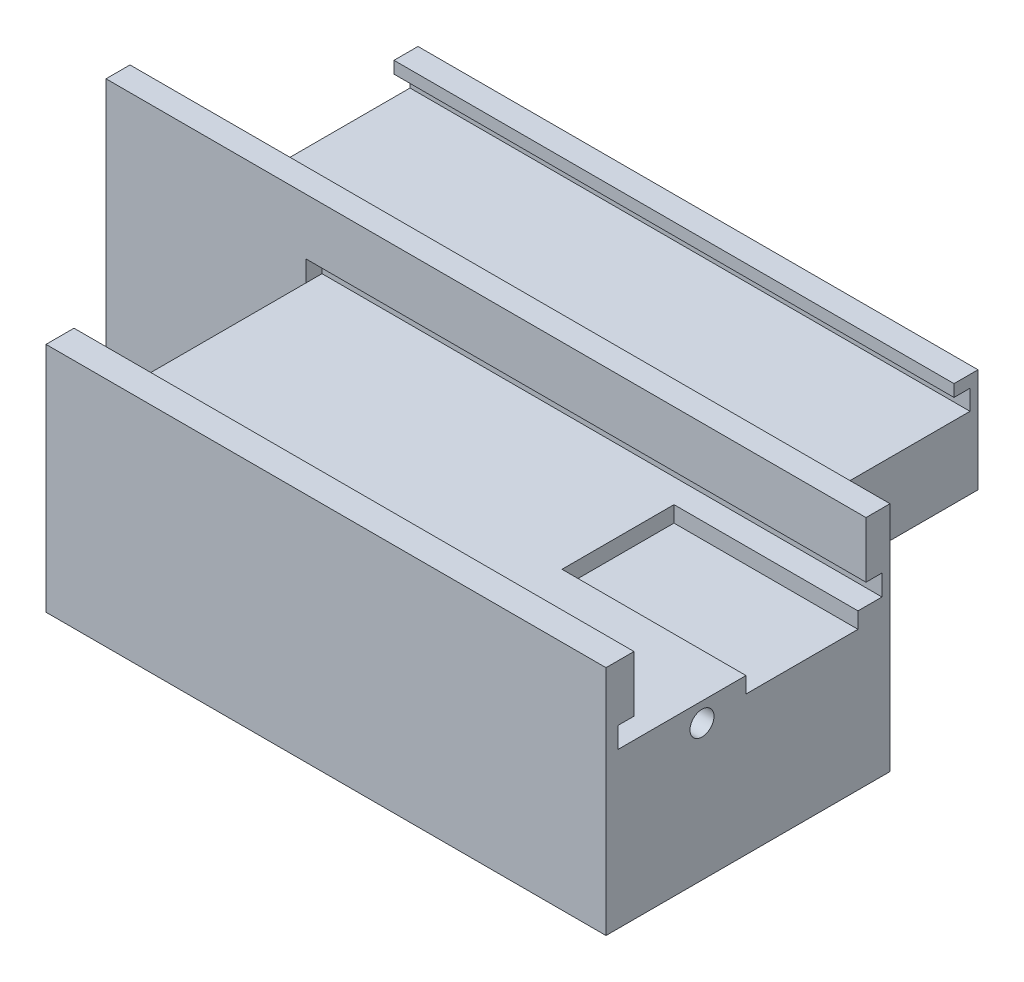
ISO-10303-21;
HEADER;
FILE_DESCRIPTION(('STEP AP214'),'2;1');
FILE_NAME('part.step','',(''),(''),'','','');
FILE_SCHEMA(('AUTOMOTIVE_DESIGN { 1 0 10303 214 1 1 1 1 }'));
ENDSEC;
DATA;
#1=APPLICATION_CONTEXT('core data for automotive mechanical design processes');
#2=APPLICATION_PROTOCOL_DEFINITION('international standard','automotive_design',2000,#1);
#3=PRODUCT_CONTEXT('',#1,'mechanical');
#4=PRODUCT('Part','Part','',(#3));
#5=PRODUCT_RELATED_PRODUCT_CATEGORY('part','',(#4));
#6=PRODUCT_DEFINITION_FORMATION('','',#4);
#7=PRODUCT_DEFINITION_CONTEXT('part definition',#1,'design');
#8=PRODUCT_DEFINITION('design','',#6,#7);
#9=PRODUCT_DEFINITION_SHAPE('','',#8);
#10=(LENGTH_UNIT() NAMED_UNIT(*) SI_UNIT(.MILLI.,.METRE.));
#11=(NAMED_UNIT(*) PLANE_ANGLE_UNIT() SI_UNIT($,.RADIAN.));
#12=(NAMED_UNIT(*) SI_UNIT($,.STERADIAN.) SOLID_ANGLE_UNIT());
#13=UNCERTAINTY_MEASURE_WITH_UNIT(LENGTH_MEASURE(1.E-05),#10,'distance_accuracy_value','');
#14=(GEOMETRIC_REPRESENTATION_CONTEXT(3) GLOBAL_UNCERTAINTY_ASSIGNED_CONTEXT((#13)) GLOBAL_UNIT_ASSIGNED_CONTEXT((#10,
#11,#12)) REPRESENTATION_CONTEXT('',''));
#15=CARTESIAN_POINT('',(0.,0.,0.));
#16=DIRECTION('',(0.,0.,1.));
#17=DIRECTION('',(1.,0.,0.));
#18=AXIS2_PLACEMENT_3D('',#15,#16,#17);
#19=CARTESIAN_POINT('',(65.2402968863677,6.11716392909726,18.1443884767127));
#20=DIRECTION('',(1.,0.,0.));
#21=DIRECTION('',(0.,-1.,0.));
#22=AXIS2_PLACEMENT_3D('',#19,#20,#21);
#23=PLANE('',#22);
#24=CARTESIAN_POINT('',(65.2402968863677,3.21716392909729,40.1443244767127));
#25=DIRECTION('',(1.,0.,0.));
#26=DIRECTION('',(0.,0.,-1.));
#27=AXIS2_PLACEMENT_3D('',#24,#25,#26);
#28=CIRCLE('',#27,1.5);
#29=CARTESIAN_POINT('',(65.2402968863677,3.21716392909729,38.6443244767127));
#30=VERTEX_POINT('',#29);
#31=EDGE_CURVE('E607',#30,#30,#28,.T.);
#32=ORIENTED_EDGE('',*,*,#31,.F.);
#33=EDGE_LOOP('',(#32));
#34=FACE_BOUND('',#33,.T.);
#35=DIRECTION('',(0.,0.,1.));
#36=VECTOR('',#35,1.);
#37=CARTESIAN_POINT('',(65.2402968863677,-13.7828360709027,52.1443244767127));
#38=LINE('',#37,#36);
#39=CARTESIAN_POINT('',(65.2402968863677,-13.7828360709027,16.6443884767128));
#40=VERTEX_POINT('',#39);
#41=CARTESIAN_POINT('',(65.2402968863677,-13.7828360709027,52.1443244767127));
#42=VERTEX_POINT('',#41);
#43=EDGE_CURVE('E313',#40,#42,#38,.T.);
#44=ORIENTED_EDGE('',*,*,#43,.F.);
#45=DIRECTION('',(0.,-1.,0.));
#46=VECTOR('',#45,1.);
#47=CARTESIAN_POINT('',(65.2402968863677,-2.28283607090271,16.6443884767127));
#48=LINE('',#47,#46);
#49=CARTESIAN_POINT('',(65.2402968863677,15.2171639290973,16.6443884767128));
#50=VERTEX_POINT('',#49);
#51=EDGE_CURVE('E251',#50,#40,#48,.T.);
#52=ORIENTED_EDGE('',*,*,#51,.F.);
#53=DIRECTION('',(0.,0.,-1.));
#54=VECTOR('',#53,1.);
#55=CARTESIAN_POINT('',(65.2402968863677,15.2171639290973,16.6443884767128));
#56=LINE('',#55,#54);
#57=CARTESIAN_POINT('',(65.2402968863677,15.2171639290973,19.6443884767127));
#58=VERTEX_POINT('',#57);
#59=EDGE_CURVE('E263',#58,#50,#56,.T.);
#60=ORIENTED_EDGE('',*,*,#59,.F.);
#61=DIRECTION('',(0.,1.,0.));
#62=VECTOR('',#61,1.);
#63=CARTESIAN_POINT('',(65.2402968863677,15.2171639290973,19.6443884767127));
#64=LINE('',#63,#62);
#65=CARTESIAN_POINT('',(65.2402968863677,8.21716392909729,19.6443884767127));
#66=VERTEX_POINT('',#65);
#67=EDGE_CURVE('E267',#66,#58,#64,.T.);
#68=ORIENTED_EDGE('',*,*,#67,.F.);
#69=DIRECTION('',(0.,0.,1.));
#70=VECTOR('',#69,1.);
#71=CARTESIAN_POINT('',(65.2402968863677,8.21716392909729,19.6443884767127));
#72=LINE('',#71,#70);
#73=CARTESIAN_POINT('',(65.2402968863677,8.21716392909729,17.6443884767127));
#74=VERTEX_POINT('',#73);
#75=EDGE_CURVE('E272',#74,#66,#72,.T.);
#76=ORIENTED_EDGE('',*,*,#75,.F.);
#77=DIRECTION('',(0.,1.,0.));
#78=VECTOR('',#77,1.);
#79=CARTESIAN_POINT('',(65.2402968863677,8.21716392909729,17.6443884767127));
#80=LINE('',#79,#78);
#81=CARTESIAN_POINT('',(65.2402968863677,5.6171639290973,17.6443884767127));
#82=VERTEX_POINT('',#81);
#83=EDGE_CURVE('E277',#82,#74,#80,.T.);
#84=ORIENTED_EDGE('',*,*,#83,.F.);
#85=DIRECTION('',(0.,0.,-1.));
#86=VECTOR('',#85,1.);
#87=CARTESIAN_POINT('',(65.2402968863677,5.6171639290973,50.6443244767127));
#88=LINE('',#87,#86);
#89=CARTESIAN_POINT('',(65.2402968863677,5.6171639290973,20.6443884767127));
#90=VERTEX_POINT('',#89);
#91=EDGE_CURVE('E287',#90,#82,#88,.T.);
#92=ORIENTED_EDGE('',*,*,#91,.F.);
#93=DIRECTION('',(0.,1.,0.));
#94=VECTOR('',#93,1.);
#95=CARTESIAN_POINT('',(65.2402968863677,3.6171639290973,20.6443884767127));
#96=LINE('',#95,#94);
#97=CARTESIAN_POINT('',(65.2402968863677,3.6171639290973,20.6443884767127));
#98=VERTEX_POINT('',#97);
#99=EDGE_CURVE('E513',#98,#90,#96,.T.);
#100=ORIENTED_EDGE('',*,*,#99,.F.);
#101=DIRECTION('',(0.,0.,-1.));
#102=VECTOR('',#101,1.);
#103=CARTESIAN_POINT('',(65.2402968863677,3.6171639290973,20.6443884767127));
#104=LINE('',#103,#102);
#105=CARTESIAN_POINT('',(65.2402968863677,3.6171639290973,34.6443884767127));
#106=VERTEX_POINT('',#105);
#107=EDGE_CURVE('E496',#106,#98,#104,.T.);
#108=ORIENTED_EDGE('',*,*,#107,.F.);
#109=DIRECTION('',(0.,1.,0.));
#110=VECTOR('',#109,1.);
#111=CARTESIAN_POINT('',(65.2402968863677,3.6171639290973,34.6443884767127));
#112=LINE('',#111,#110);
#113=CARTESIAN_POINT('',(65.2402968863677,5.6171639290973,34.6443884767127));
#114=VERTEX_POINT('',#113);
#115=EDGE_CURVE('E393',#106,#114,#112,.T.);
#116=ORIENTED_EDGE('',*,*,#115,.T.);
#117=CARTESIAN_POINT('',(65.2402968863677,5.6171639290973,50.6443244767127));
#118=VERTEX_POINT('',#117);
#119=EDGE_CURVE('E282',#118,#114,#88,.T.);
#120=ORIENTED_EDGE('',*,*,#119,.F.);
#121=DIRECTION('',(0.,-1.,0.));
#122=VECTOR('',#121,1.);
#123=CARTESIAN_POINT('',(65.2402968863677,5.6171639290973,50.6443244767127));
#124=LINE('',#123,#122);
#125=CARTESIAN_POINT('',(65.2402968863677,8.21716392909729,50.6443244767127));
#126=VERTEX_POINT('',#125);
#127=EDGE_CURVE('E288',#126,#118,#124,.T.);
#128=ORIENTED_EDGE('',*,*,#127,.F.);
#129=DIRECTION('',(0.,0.,1.));
#130=VECTOR('',#129,1.);
#131=CARTESIAN_POINT('',(65.2402968863677,8.21716392909729,50.6443244767127));
#132=LINE('',#131,#130);
#133=CARTESIAN_POINT('',(65.2402968863677,8.21716392909729,48.6443244767127));
#134=VERTEX_POINT('',#133);
#135=EDGE_CURVE('E293',#134,#126,#132,.T.);
#136=ORIENTED_EDGE('',*,*,#135,.F.);
#137=DIRECTION('',(0.,-1.,0.));
#138=VECTOR('',#137,1.);
#139=CARTESIAN_POINT('',(65.2402968863677,8.21716392909729,48.6443244767127));
#140=LINE('',#139,#138);
#141=CARTESIAN_POINT('',(65.2402968863677,15.2171639290973,48.6443244767127));
#142=VERTEX_POINT('',#141);
#143=EDGE_CURVE('E298',#142,#134,#140,.T.);
#144=ORIENTED_EDGE('',*,*,#143,.F.);
#145=DIRECTION('',(0.,0.,-1.));
#146=VECTOR('',#145,1.);
#147=CARTESIAN_POINT('',(65.2402968863677,15.2171639290973,48.6443244767127));
#148=LINE('',#147,#146);
#149=CARTESIAN_POINT('',(65.2402968863677,15.2171639290973,52.1443244767127));
#150=VERTEX_POINT('',#149);
#151=EDGE_CURVE('E303',#150,#142,#148,.T.);
#152=ORIENTED_EDGE('',*,*,#151,.F.);
#153=DIRECTION('',(0.,1.,0.));
#154=VECTOR('',#153,1.);
#155=CARTESIAN_POINT('',(65.2402968863677,15.2171639290973,52.1443244767127));
#156=LINE('',#155,#154);
#157=EDGE_CURVE('E308',#42,#150,#156,.T.);
#158=ORIENTED_EDGE('',*,*,#157,.F.);
#159=EDGE_LOOP('',(#44,#52,#60,#68,#76,#84,#92,#100,#108,#116,#120,#128,#136,#144,#152,#158));
#160=FACE_BOUND('',#159,.T.);
#161=ADVANCED_FACE('F43',(#34,#160),#23,.T.);
#162=CARTESIAN_POINT('',(-29.7595631136323,0.,0.));
#163=DIRECTION('',(1.,0.,0.));
#164=DIRECTION('',(0.,0.,-1.));
#165=AXIS2_PLACEMENT_3D('',#162,#163,#164);
#166=PLANE('',#165);
#167=CARTESIAN_POINT('',(-29.7595631136323,-7.18283607090269,-1.35561152328723));
#168=DIRECTION('',(-1.,0.,0.));
#169=DIRECTION('',(0.,0.,1.));
#170=AXIS2_PLACEMENT_3D('',#167,#168,#169);
#171=CIRCLE('',#170,1.5);
#172=CARTESIAN_POINT('',(-29.7595631136323,-7.18283607090269,0.144388476712772));
#173=VERTEX_POINT('',#172);
#174=EDGE_CURVE('E617',#173,#173,#171,.T.);
#175=ORIENTED_EDGE('',*,*,#174,.F.);
#176=EDGE_LOOP('',(#175));
#177=FACE_BOUND('',#176,.T.);
#178=DIRECTION('',(0.,0.,1.));
#179=VECTOR('',#178,1.);
#180=CARTESIAN_POINT('',(-29.7595631136323,-13.7828360709027,52.1443244767127));
#181=LINE('',#180,#179);
#182=CARTESIAN_POINT('',(-29.7595631136323,-13.7828360709027,-19.3556115232873));
#183=VERTEX_POINT('',#182);
#184=CARTESIAN_POINT('',(-29.7595631136323,-13.7828360709027,19.6443884767127));
#185=VERTEX_POINT('',#184);
#186=EDGE_CURVE('E379',#183,#185,#181,.T.);
#187=ORIENTED_EDGE('',*,*,#186,.T.);
#188=DIRECTION('',(0.,1.,0.));
#189=VECTOR('',#188,1.);
#190=CARTESIAN_POINT('',(-29.7595631136323,15.2171639290973,19.6443884767127));
#191=LINE('',#190,#189);
#192=CARTESIAN_POINT('',(-29.7595631136323,15.2171639290973,19.6443884767127));
#193=VERTEX_POINT('',#192);
#194=EDGE_CURVE('E375',#185,#193,#191,.T.);
#195=ORIENTED_EDGE('',*,*,#194,.T.);
#196=DIRECTION('',(0.,0.,-1.));
#197=VECTOR('',#196,1.);
#198=CARTESIAN_POINT('',(-29.7595631136323,15.2171639290973,16.6443884767128));
#199=LINE('',#198,#197);
#200=CARTESIAN_POINT('',(-29.7595631136323,15.2171639290973,16.6443884767128));
#201=VERTEX_POINT('',#200);
#202=EDGE_CURVE('E371',#193,#201,#199,.T.);
#203=ORIENTED_EDGE('',*,*,#202,.T.);
#204=DIRECTION('',(0.,-1.,0.));
#205=VECTOR('',#204,1.);
#206=CARTESIAN_POINT('',(-29.7595631136323,-2.28283607090271,16.6443884767127));
#207=LINE('',#206,#205);
#208=CARTESIAN_POINT('',(-29.7595631136323,-2.28283607090271,16.6443884767127));
#209=VERTEX_POINT('',#208);
#210=EDGE_CURVE('E365',#201,#209,#207,.T.);
#211=ORIENTED_EDGE('',*,*,#210,.T.);
#212=DIRECTION('',(0.,0.,1.));
#213=VECTOR('',#212,1.);
#214=CARTESIAN_POINT('',(-29.7595631136323,-2.28283607090271,18.6443884767127));
#215=LINE('',#214,#213);
#216=CARTESIAN_POINT('',(-29.7595631136323,-2.28283607090271,18.6443884767127));
#217=VERTEX_POINT('',#216);
#218=EDGE_CURVE('E247',#209,#217,#215,.T.);
#219=ORIENTED_EDGE('',*,*,#218,.T.);
#220=DIRECTION('',(0.,-1.,0.));
#221=VECTOR('',#220,1.);
#222=CARTESIAN_POINT('',(-29.7595631136323,-4.78283607090269,18.6443884767127));
#223=LINE('',#222,#221);
#224=CARTESIAN_POINT('',(-29.7595631136323,-4.78283607090269,18.6443884767127));
#225=VERTEX_POINT('',#224);
#226=EDGE_CURVE('E347',#217,#225,#223,.T.);
#227=ORIENTED_EDGE('',*,*,#226,.T.);
#228=DIRECTION('',(0.,0.,-1.));
#229=VECTOR('',#228,1.);
#230=CARTESIAN_POINT('',(-29.7595631136323,-4.78283607090269,-18.3556115232873));
#231=LINE('',#230,#229);
#232=CARTESIAN_POINT('',(-29.7595631136323,-4.78283607090269,-18.3556115232873));
#233=VERTEX_POINT('',#232);
#234=EDGE_CURVE('E350',#225,#233,#231,.T.);
#235=ORIENTED_EDGE('',*,*,#234,.T.);
#236=DIRECTION('',(0.,1.,0.));
#237=VECTOR('',#236,1.);
#238=CARTESIAN_POINT('',(-29.7595631136323,-2.28283607090271,-18.3556115232873));
#239=LINE('',#238,#237);
#240=CARTESIAN_POINT('',(-29.7595631136323,-2.28283607090271,-18.3556115232873));
#241=VERTEX_POINT('',#240);
#242=EDGE_CURVE('E358',#233,#241,#239,.T.);
#243=ORIENTED_EDGE('',*,*,#242,.T.);
#244=DIRECTION('',(0.,0.,1.));
#245=VECTOR('',#244,1.);
#246=CARTESIAN_POINT('',(-29.7595631136323,-2.28283607090271,-16.3556115232873));
#247=LINE('',#246,#245);
#248=CARTESIAN_POINT('',(-29.7595631136323,-2.28283607090271,-16.3556115232873));
#249=VERTEX_POINT('',#248);
#250=EDGE_CURVE('E319',#241,#249,#247,.T.);
#251=ORIENTED_EDGE('',*,*,#250,.T.);
#252=DIRECTION('',(0.,1.,0.));
#253=VECTOR('',#252,1.);
#254=CARTESIAN_POINT('',(-29.7595631136323,-0.782836070902714,-16.3556115232873));
#255=LINE('',#254,#253);
#256=CARTESIAN_POINT('',(-29.7595631136323,-0.782836070902714,-16.3556115232873));
#257=VERTEX_POINT('',#256);
#258=EDGE_CURVE('E390',#249,#257,#255,.T.);
#259=ORIENTED_EDGE('',*,*,#258,.T.);
#260=DIRECTION('',(0.,0.,-1.));
#261=VECTOR('',#260,1.);
#262=CARTESIAN_POINT('',(-29.7595631136323,-0.782836070902714,-19.3556115232873));
#263=LINE('',#262,#261);
#264=CARTESIAN_POINT('',(-29.7595631136323,-0.782836070902714,-19.3556115232873));
#265=VERTEX_POINT('',#264);
#266=EDGE_CURVE('E386',#257,#265,#263,.T.);
#267=ORIENTED_EDGE('',*,*,#266,.T.);
#268=DIRECTION('',(0.,-1.,0.));
#269=VECTOR('',#268,1.);
#270=CARTESIAN_POINT('',(-29.7595631136323,-13.7828360709027,-19.3556115232873));
#271=LINE('',#270,#269);
#272=EDGE_CURVE('E382',#265,#183,#271,.T.);
#273=ORIENTED_EDGE('',*,*,#272,.T.);
#274=EDGE_LOOP('',(#187,#195,#203,#211,#219,#227,#235,#243,#251,#259,#267,#273));
#275=FACE_BOUND('',#274,.T.);
#276=ADVANCED_FACE('F361',(#177,#275),#166,.F.);
#277=CARTESIAN_POINT('',(142.397544426726,-0.782836070902714,-19.3556115232873));
#278=DIRECTION('',(0.,1.,0.));
#279=DIRECTION('',(0.,0.,1.));
#280=AXIS2_PLACEMENT_3D('',#277,#278,#279);
#281=PLANE('',#280);
#282=DIRECTION('',(0.,0.,1.));
#283=VECTOR('',#282,1.);
#284=CARTESIAN_POINT('',(40.2404368863677,-0.782836070902714,-19.3556115232873));
#285=LINE('',#284,#283);
#286=CARTESIAN_POINT('',(40.2404368863677,-0.782836070902718,-19.3556115232873));
#287=VERTEX_POINT('',#286);
#288=CARTESIAN_POINT('',(40.2404368863677,-0.782836070902714,-16.3556115232873));
#289=VERTEX_POINT('',#288);
#290=EDGE_CURVE('E65',#287,#289,#285,.T.);
#291=ORIENTED_EDGE('',*,*,#290,.F.);
#292=DIRECTION('',(-1.,0.,0.));
#293=VECTOR('',#292,1.);
#294=CARTESIAN_POINT('',(142.397544426726,-0.782836070902714,-19.3556115232873));
#295=LINE('',#294,#293);
#296=EDGE_CURVE('E317',#287,#265,#295,.T.);
#297=ORIENTED_EDGE('',*,*,#296,.T.);
#298=ORIENTED_EDGE('',*,*,#266,.F.);
#299=DIRECTION('',(-1.,0.,0.));
#300=VECTOR('',#299,1.);
#301=CARTESIAN_POINT('',(142.397544426726,-0.782836070902714,-16.3556115232873));
#302=LINE('',#301,#300);
#303=EDGE_CURVE('E51',#289,#257,#302,.T.);
#304=ORIENTED_EDGE('',*,*,#303,.F.);
#305=EDGE_LOOP('',(#291,#297,#298,#304));
#306=FACE_BOUND('',#305,.T.);
#307=ADVANCED_FACE('F602',(#306),#281,.T.);
#308=CARTESIAN_POINT('',(142.397544426726,-13.7828360709027,-19.3556115232873));
#309=DIRECTION('',(0.,0.,-1.));
#310=DIRECTION('',(0.,1.,0.));
#311=AXIS2_PLACEMENT_3D('',#308,#309,#310);
#312=PLANE('',#311);
#313=DIRECTION('',(0.,1.,0.));
#314=VECTOR('',#313,1.);
#315=CARTESIAN_POINT('',(40.2404368863677,-13.7828360709027,-19.3556115232873));
#316=LINE('',#315,#314);
#317=CARTESIAN_POINT('',(40.2404368863677,-13.7828360709027,-19.3556115232873));
#318=VERTEX_POINT('',#317);
#319=EDGE_CURVE('E464',#318,#287,#316,.T.);
#320=ORIENTED_EDGE('',*,*,#319,.F.);
#321=DIRECTION('',(-1.,0.,0.));
#322=VECTOR('',#321,1.);
#323=CARTESIAN_POINT('',(142.397544426726,-13.7828360709027,-19.3556115232873));
#324=LINE('',#323,#322);
#325=EDGE_CURVE('E314',#318,#183,#324,.T.);
#326=ORIENTED_EDGE('',*,*,#325,.T.);
#327=ORIENTED_EDGE('',*,*,#272,.F.);
#328=ORIENTED_EDGE('',*,*,#296,.F.);
#329=EDGE_LOOP('',(#320,#326,#327,#328));
#330=FACE_BOUND('',#329,.T.);
#331=ADVANCED_FACE('F897',(#330),#312,.T.);
#332=CARTESIAN_POINT('',(142.397544426726,-13.7828360709027,52.1443244767127));
#333=DIRECTION('',(0.,-1.,0.));
#334=DIRECTION('',(0.,0.,-1.));
#335=AXIS2_PLACEMENT_3D('',#332,#333,#334);
#336=PLANE('',#335);
#337=DIRECTION('',(-1.,0.,0.));
#338=VECTOR('',#337,1.);
#339=CARTESIAN_POINT('',(-29.7595631136323,-13.7828360709027,19.6443884767127));
#340=LINE('',#339,#338);
#341=CARTESIAN_POINT('',(-4.75956311363234,-13.7828360709027,19.6443884767127));
#342=VERTEX_POINT('',#341);
#343=EDGE_CURVE('E444',#342,#185,#340,.T.);
#344=ORIENTED_EDGE('',*,*,#343,.T.);
#345=ORIENTED_EDGE('',*,*,#186,.F.);
#346=ORIENTED_EDGE('',*,*,#325,.F.);
#347=DIRECTION('',(0.,0.,1.));
#348=VECTOR('',#347,1.);
#349=CARTESIAN_POINT('',(40.2404368863677,-13.7828360709027,-19.3556115232873));
#350=LINE('',#349,#348);
#351=CARTESIAN_POINT('',(40.2404368863677,-13.7828360709027,16.6443884767128));
#352=VERTEX_POINT('',#351);
#353=EDGE_CURVE('E439',#318,#352,#350,.T.);
#354=ORIENTED_EDGE('',*,*,#353,.T.);
#355=DIRECTION('',(1.,0.,0.));
#356=VECTOR('',#355,1.);
#357=CARTESIAN_POINT('',(65.2402968863677,-13.7828360709027,16.6443884767128));
#358=LINE('',#357,#356);
#359=EDGE_CURVE('E447',#352,#40,#358,.T.);
#360=ORIENTED_EDGE('',*,*,#359,.T.);
#361=ORIENTED_EDGE('',*,*,#43,.T.);
#362=DIRECTION('',(-1.,0.,0.));
#363=VECTOR('',#362,1.);
#364=CARTESIAN_POINT('',(142.397544426726,-13.7828360709027,52.1443244767127));
#365=LINE('',#364,#363);
#366=CARTESIAN_POINT('',(-4.75956311363235,-13.7828360709027,52.1443244767127));
#367=VERTEX_POINT('',#366);
#368=EDGE_CURVE('E309',#42,#367,#365,.T.);
#369=ORIENTED_EDGE('',*,*,#368,.T.);
#370=DIRECTION('',(0.,0.,-1.));
#371=VECTOR('',#370,1.);
#372=CARTESIAN_POINT('',(-4.75956311363235,-13.7828360709027,52.1443244767127));
#373=LINE('',#372,#371);
#374=EDGE_CURVE('E438',#367,#342,#373,.T.);
#375=ORIENTED_EDGE('',*,*,#374,.T.);
#376=EDGE_LOOP('',(#344,#345,#346,#354,#360,#361,#369,#375));
#377=FACE_BOUND('',#376,.T.);
#378=ADVANCED_FACE('F571',(#377),#336,.T.);
#379=CARTESIAN_POINT('',(142.397544426726,15.2171639290973,52.1443244767127));
#380=DIRECTION('',(0.,0.,1.));
#381=DIRECTION('',(0.,-1.,0.));
#382=AXIS2_PLACEMENT_3D('',#379,#380,#381);
#383=PLANE('',#382);
#384=DIRECTION('',(0.,1.,0.));
#385=VECTOR('',#384,1.);
#386=CARTESIAN_POINT('',(-4.75956311363235,-13.7828360709027,52.1443244767127));
#387=LINE('',#386,#385);
#388=CARTESIAN_POINT('',(-4.75956311363235,15.2171639290973,52.1443244767127));
#389=VERTEX_POINT('',#388);
#390=EDGE_CURVE('E456',#367,#389,#387,.T.);
#391=ORIENTED_EDGE('',*,*,#390,.F.);
#392=ORIENTED_EDGE('',*,*,#368,.F.);
#393=ORIENTED_EDGE('',*,*,#157,.T.);
#394=DIRECTION('',(-1.,0.,0.));
#395=VECTOR('',#394,1.);
#396=CARTESIAN_POINT('',(142.397544426726,15.2171639290973,52.1443244767127));
#397=LINE('',#396,#395);
#398=EDGE_CURVE('E304',#150,#389,#397,.T.);
#399=ORIENTED_EDGE('',*,*,#398,.T.);
#400=EDGE_LOOP('',(#391,#392,#393,#399));
#401=FACE_BOUND('',#400,.T.);
#402=ADVANCED_FACE('F427',(#401),#383,.T.);
#403=CARTESIAN_POINT('',(142.397544426726,15.2171639290973,48.6443244767127));
#404=DIRECTION('',(0.,1.,0.));
#405=DIRECTION('',(0.,0.,1.));
#406=AXIS2_PLACEMENT_3D('',#403,#404,#405);
#407=PLANE('',#406);
#408=DIRECTION('',(0.,0.,-1.));
#409=VECTOR('',#408,1.);
#410=CARTESIAN_POINT('',(-4.75956311363235,15.2171639290973,52.1443244767127));
#411=LINE('',#410,#409);
#412=CARTESIAN_POINT('',(-4.75956311363235,15.2171639290973,48.6443244767127));
#413=VERTEX_POINT('',#412);
#414=EDGE_CURVE('E435',#389,#413,#411,.T.);
#415=ORIENTED_EDGE('',*,*,#414,.F.);
#416=ORIENTED_EDGE('',*,*,#398,.F.);
#417=ORIENTED_EDGE('',*,*,#151,.T.);
#418=DIRECTION('',(-1.,0.,0.));
#419=VECTOR('',#418,1.);
#420=CARTESIAN_POINT('',(142.397544426726,15.2171639290973,48.6443244767127));
#421=LINE('',#420,#419);
#422=EDGE_CURVE('E299',#142,#413,#421,.T.);
#423=ORIENTED_EDGE('',*,*,#422,.T.);
#424=EDGE_LOOP('',(#415,#416,#417,#423));
#425=FACE_BOUND('',#424,.T.);
#426=ADVANCED_FACE('F434',(#425),#407,.T.);
#427=CARTESIAN_POINT('',(142.397544426726,8.21716392909729,48.6443244767127));
#428=DIRECTION('',(0.,0.,-1.));
#429=DIRECTION('',(-1.,0.,0.));
#430=AXIS2_PLACEMENT_3D('',#427,#428,#429);
#431=PLANE('',#430);
#432=DIRECTION('',(0.,-1.,0.));
#433=VECTOR('',#432,1.);
#434=CARTESIAN_POINT('',(-4.75956311363235,8.21716392909729,48.6443244767127));
#435=LINE('',#434,#433);
#436=CARTESIAN_POINT('',(-4.75956311363235,8.21716392909729,48.6443244767127));
#437=VERTEX_POINT('',#436);
#438=EDGE_CURVE('E492',#413,#437,#435,.T.);
#439=ORIENTED_EDGE('',*,*,#438,.F.);
#440=ORIENTED_EDGE('',*,*,#422,.F.);
#441=ORIENTED_EDGE('',*,*,#143,.T.);
#442=DIRECTION('',(-1.,0.,0.));
#443=VECTOR('',#442,1.);
#444=CARTESIAN_POINT('',(142.397544426726,8.21716392909729,48.6443244767127));
#445=LINE('',#444,#443);
#446=EDGE_CURVE('E294',#134,#437,#445,.T.);
#447=ORIENTED_EDGE('',*,*,#446,.T.);
#448=EDGE_LOOP('',(#439,#440,#441,#447));
#449=FACE_BOUND('',#448,.T.);
#450=ADVANCED_FACE('F862',(#449),#431,.T.);
#451=CARTESIAN_POINT('',(142.397544426726,8.21716392909729,50.6443244767127));
#452=DIRECTION('',(0.,-1.,0.));
#453=DIRECTION('',(0.,0.,-1.));
#454=AXIS2_PLACEMENT_3D('',#451,#452,#453);
#455=PLANE('',#454);
#456=DIRECTION('',(0.,0.,1.));
#457=VECTOR('',#456,1.);
#458=CARTESIAN_POINT('',(-4.75956311363235,8.21716392909729,50.6443244767127));
#459=LINE('',#458,#457);
#460=CARTESIAN_POINT('',(-4.75956311363235,8.21716392909729,50.6443244767127));
#461=VERTEX_POINT('',#460);
#462=EDGE_CURVE('E489',#437,#461,#459,.T.);
#463=ORIENTED_EDGE('',*,*,#462,.F.);
#464=ORIENTED_EDGE('',*,*,#446,.F.);
#465=ORIENTED_EDGE('',*,*,#135,.T.);
#466=DIRECTION('',(-1.,0.,0.));
#467=VECTOR('',#466,1.);
#468=CARTESIAN_POINT('',(142.397544426726,8.21716392909729,50.6443244767127));
#469=LINE('',#468,#467);
#470=EDGE_CURVE('E289',#126,#461,#469,.T.);
#471=ORIENTED_EDGE('',*,*,#470,.T.);
#472=EDGE_LOOP('',(#463,#464,#465,#471));
#473=FACE_BOUND('',#472,.T.);
#474=ADVANCED_FACE('F852',(#473),#455,.T.);
#475=CARTESIAN_POINT('',(142.397544426726,5.6171639290973,50.6443244767127));
#476=DIRECTION('',(0.,0.,-1.));
#477=DIRECTION('',(-1.,0.,0.));
#478=AXIS2_PLACEMENT_3D('',#475,#476,#477);
#479=PLANE('',#478);
#480=DIRECTION('',(0.,-1.,0.));
#481=VECTOR('',#480,1.);
#482=CARTESIAN_POINT('',(-4.75956311363235,5.6171639290973,50.6443244767127));
#483=LINE('',#482,#481);
#484=CARTESIAN_POINT('',(-4.75956311363235,5.6171639290973,50.6443244767127));
#485=VERTEX_POINT('',#484);
#486=EDGE_CURVE('E58',#461,#485,#483,.T.);
#487=ORIENTED_EDGE('',*,*,#486,.F.);
#488=ORIENTED_EDGE('',*,*,#470,.F.);
#489=ORIENTED_EDGE('',*,*,#127,.T.);
#490=DIRECTION('',(-1.,0.,0.));
#491=VECTOR('',#490,1.);
#492=CARTESIAN_POINT('',(142.397544426726,5.6171639290973,50.6443244767127));
#493=LINE('',#492,#491);
#494=EDGE_CURVE('E283',#118,#485,#493,.T.);
#495=ORIENTED_EDGE('',*,*,#494,.T.);
#496=EDGE_LOOP('',(#487,#488,#489,#495));
#497=FACE_BOUND('',#496,.T.);
#498=ADVANCED_FACE('F843',(#497),#479,.T.);
#499=CARTESIAN_POINT('',(142.397544426726,5.6171639290973,50.6443244767127));
#500=DIRECTION('',(0.,1.,0.));
#501=DIRECTION('',(0.,0.,1.));
#502=AXIS2_PLACEMENT_3D('',#499,#500,#501);
#503=PLANE('',#502);
#504=DIRECTION('',(0.,0.,1.));
#505=VECTOR('',#504,1.);
#506=CARTESIAN_POINT('',(-4.75956311363235,5.6171639290973,-7.49044790628368));
#507=LINE('',#506,#505);
#508=CARTESIAN_POINT('',(-4.75956311363235,5.6171639290973,17.6443884767127));
#509=VERTEX_POINT('',#508);
#510=CARTESIAN_POINT('',(-4.75956311363235,5.6171639290973,19.6443884767127));
#511=VERTEX_POINT('',#510);
#512=EDGE_CURVE('E450',#509,#511,#507,.T.);
#513=ORIENTED_EDGE('',*,*,#512,.T.);
#514=DIRECTION('',(0.,0.,-1.));
#515=VECTOR('',#514,1.);
#516=CARTESIAN_POINT('',(-4.75956311363235,5.6171639290973,50.6443244767127));
#517=LINE('',#516,#515);
#518=EDGE_CURVE('E484',#485,#511,#517,.T.);
#519=ORIENTED_EDGE('',*,*,#518,.F.);
#520=ORIENTED_EDGE('',*,*,#494,.F.);
#521=ORIENTED_EDGE('',*,*,#119,.T.);
#522=DIRECTION('',(1.,0.,0.));
#523=VECTOR('',#522,1.);
#524=CARTESIAN_POINT('',(65.2402968863677,5.6171639290973,34.6443884767127));
#525=LINE('',#524,#523);
#526=CARTESIAN_POINT('',(42.2402968863677,5.6171639290973,34.6443884767127));
#527=VERTEX_POINT('',#526);
#528=EDGE_CURVE('E501',#527,#114,#525,.T.);
#529=ORIENTED_EDGE('',*,*,#528,.F.);
#530=DIRECTION('',(0.,0.,1.));
#531=VECTOR('',#530,1.);
#532=CARTESIAN_POINT('',(42.2402968863677,5.6171639290973,20.6443884767127));
#533=LINE('',#532,#531);
#534=CARTESIAN_POINT('',(42.2402968863677,5.6171639290973,20.6443884767127));
#535=VERTEX_POINT('',#534);
#536=EDGE_CURVE('E517',#535,#527,#533,.T.);
#537=ORIENTED_EDGE('',*,*,#536,.F.);
#538=DIRECTION('',(-1.,0.,0.));
#539=VECTOR('',#538,1.);
#540=CARTESIAN_POINT('',(65.2402968863677,5.6171639290973,20.6443884767127));
#541=LINE('',#540,#539);
#542=EDGE_CURVE('E495',#90,#535,#541,.T.);
#543=ORIENTED_EDGE('',*,*,#542,.F.);
#544=ORIENTED_EDGE('',*,*,#91,.T.);
#545=DIRECTION('',(-1.,0.,0.));
#546=VECTOR('',#545,1.);
#547=CARTESIAN_POINT('',(142.397544426726,5.6171639290973,17.6443884767127));
#548=LINE('',#547,#546);
#549=EDGE_CURVE('E278',#82,#509,#548,.T.);
#550=ORIENTED_EDGE('',*,*,#549,.T.);
#551=EDGE_LOOP('',(#513,#519,#520,#521,#529,#537,#543,#544,#550));
#552=FACE_BOUND('',#551,.T.);
#553=ADVANCED_FACE('F561',(#552),#503,.T.);
#554=CARTESIAN_POINT('',(142.397544426726,8.21716392909729,17.6443884767127));
#555=DIRECTION('',(0.,0.,1.));
#556=DIRECTION('',(0.,-1.,0.));
#557=AXIS2_PLACEMENT_3D('',#554,#555,#556);
#558=PLANE('',#557);
#559=DIRECTION('',(0.,-1.,0.));
#560=VECTOR('',#559,1.);
#561=CARTESIAN_POINT('',(-4.75956311363235,8.21716392909732,17.6443884767127));
#562=LINE('',#561,#560);
#563=CARTESIAN_POINT('',(-4.75956311363235,8.21716392909729,17.6443884767127));
#564=VERTEX_POINT('',#563);
#565=EDGE_CURVE('E469',#564,#509,#562,.T.);
#566=ORIENTED_EDGE('',*,*,#565,.T.);
#567=ORIENTED_EDGE('',*,*,#549,.F.);
#568=ORIENTED_EDGE('',*,*,#83,.T.);
#569=DIRECTION('',(-1.,0.,0.));
#570=VECTOR('',#569,1.);
#571=CARTESIAN_POINT('',(142.397544426726,8.21716392909729,17.6443884767127));
#572=LINE('',#571,#570);
#573=EDGE_CURVE('E273',#74,#564,#572,.T.);
#574=ORIENTED_EDGE('',*,*,#573,.T.);
#575=EDGE_LOOP('',(#566,#567,#568,#574));
#576=FACE_BOUND('',#575,.T.);
#577=ADVANCED_FACE('F586',(#576),#558,.T.);
#578=CARTESIAN_POINT('',(142.397544426726,8.21716392909729,19.6443884767127));
#579=DIRECTION('',(0.,-1.,0.));
#580=DIRECTION('',(0.,0.,-1.));
#581=AXIS2_PLACEMENT_3D('',#578,#579,#580);
#582=PLANE('',#581);
#583=DIRECTION('',(0.,0.,1.));
#584=VECTOR('',#583,1.);
#585=CARTESIAN_POINT('',(-4.75956311363235,8.21716392909729,-7.49044790628368));
#586=LINE('',#585,#584);
#587=CARTESIAN_POINT('',(-4.75956311363235,8.21716392909729,19.6443884767127));
#588=VERTEX_POINT('',#587);
#589=EDGE_CURVE('E552',#564,#588,#586,.T.);
#590=ORIENTED_EDGE('',*,*,#589,.F.);
#591=ORIENTED_EDGE('',*,*,#573,.F.);
#592=ORIENTED_EDGE('',*,*,#75,.T.);
#593=DIRECTION('',(-1.,0.,0.));
#594=VECTOR('',#593,1.);
#595=CARTESIAN_POINT('',(142.397544426726,8.21716392909729,19.6443884767127));
#596=LINE('',#595,#594);
#597=EDGE_CURVE('E268',#66,#588,#596,.T.);
#598=ORIENTED_EDGE('',*,*,#597,.T.);
#599=EDGE_LOOP('',(#590,#591,#592,#598));
#600=FACE_BOUND('',#599,.T.);
#601=ADVANCED_FACE('F581',(#600),#582,.T.);
#602=CARTESIAN_POINT('',(142.397544426726,15.2171639290973,19.6443884767127));
#603=DIRECTION('',(0.,0.,1.));
#604=DIRECTION('',(0.,-1.,0.));
#605=AXIS2_PLACEMENT_3D('',#602,#603,#604);
#606=PLANE('',#605);
#607=DIRECTION('',(-1.,0.,0.));
#608=VECTOR('',#607,1.);
#609=CARTESIAN_POINT('',(142.397544426726,15.2171639290973,19.6443884767127));
#610=LINE('',#609,#608);
#611=EDGE_CURVE('E264',#58,#193,#610,.T.);
#612=ORIENTED_EDGE('',*,*,#611,.T.);
#613=ORIENTED_EDGE('',*,*,#194,.F.);
#614=ORIENTED_EDGE('',*,*,#343,.F.);
#615=DIRECTION('',(0.,1.,0.));
#616=VECTOR('',#615,1.);
#617=CARTESIAN_POINT('',(-4.75956311363234,-13.7828360709027,19.6443884767127));
#618=LINE('',#617,#616);
#619=EDGE_CURVE('E457',#342,#511,#618,.T.);
#620=ORIENTED_EDGE('',*,*,#619,.T.);
#621=DIRECTION('',(0.,1.,0.));
#622=VECTOR('',#621,1.);
#623=CARTESIAN_POINT('',(-4.75956311363235,8.21716392909729,19.6443884767127));
#624=LINE('',#623,#622);
#625=EDGE_CURVE('E546',#511,#588,#624,.T.);
#626=ORIENTED_EDGE('',*,*,#625,.T.);
#627=ORIENTED_EDGE('',*,*,#597,.F.);
#628=ORIENTED_EDGE('',*,*,#67,.T.);
#629=EDGE_LOOP('',(#612,#613,#614,#620,#626,#627,#628));
#630=FACE_BOUND('',#629,.T.);
#631=ADVANCED_FACE('F567',(#630),#606,.T.);
#632=CARTESIAN_POINT('',(142.397544426726,15.2171639290973,16.6443884767128));
#633=DIRECTION('',(0.,1.,0.));
#634=DIRECTION('',(0.,0.,1.));
#635=AXIS2_PLACEMENT_3D('',#632,#633,#634);
#636=PLANE('',#635);
#637=ORIENTED_EDGE('',*,*,#611,.F.);
#638=ORIENTED_EDGE('',*,*,#59,.T.);
#639=DIRECTION('',(-1.,0.,0.));
#640=VECTOR('',#639,1.);
#641=CARTESIAN_POINT('',(142.397544426726,15.2171639290973,16.6443884767128));
#642=LINE('',#641,#640);
#643=EDGE_CURVE('E257',#50,#201,#642,.T.);
#644=ORIENTED_EDGE('',*,*,#643,.T.);
#645=ORIENTED_EDGE('',*,*,#202,.F.);
#646=EDGE_LOOP('',(#637,#638,#644,#645));
#647=FACE_BOUND('',#646,.T.);
#648=ADVANCED_FACE('F578',(#647),#636,.T.);
#649=CARTESIAN_POINT('',(142.397544426726,-2.28283607090271,16.6443884767127));
#650=DIRECTION('',(0.,0.,-1.));
#651=DIRECTION('',(0.,1.,0.));
#652=AXIS2_PLACEMENT_3D('',#649,#650,#651);
#653=PLANE('',#652);
#654=ORIENTED_EDGE('',*,*,#210,.F.);
#655=ORIENTED_EDGE('',*,*,#643,.F.);
#656=ORIENTED_EDGE('',*,*,#51,.T.);
#657=ORIENTED_EDGE('',*,*,#359,.F.);
#658=DIRECTION('',(0.,1.,0.));
#659=VECTOR('',#658,1.);
#660=CARTESIAN_POINT('',(40.2404368863677,-13.7828360709027,16.6443884767128));
#661=LINE('',#660,#659);
#662=CARTESIAN_POINT('',(40.2404368863677,-4.78283607090266,16.6443884767127));
#663=VERTEX_POINT('',#662);
#664=EDGE_CURVE('E241',#352,#663,#661,.T.);
#665=ORIENTED_EDGE('',*,*,#664,.T.);
#666=DIRECTION('',(0.,1.,0.));
#667=VECTOR('',#666,1.);
#668=CARTESIAN_POINT('',(40.2404368863677,-2.28283607090287,16.6443884767127));
#669=LINE('',#668,#667);
#670=CARTESIAN_POINT('',(40.2404368863677,-2.28283607090287,16.6443884767127));
#671=VERTEX_POINT('',#670);
#672=EDGE_CURVE('E224',#663,#671,#669,.T.);
#673=ORIENTED_EDGE('',*,*,#672,.T.);
#674=DIRECTION('',(-1.,0.,0.));
#675=VECTOR('',#674,1.);
#676=CARTESIAN_POINT('',(142.397544426726,-2.28283607090271,16.6443884767127));
#677=LINE('',#676,#675);
#678=EDGE_CURVE('E238',#671,#209,#677,.T.);
#679=ORIENTED_EDGE('',*,*,#678,.T.);
#680=EDGE_LOOP('',(#654,#655,#656,#657,#665,#673,#679));
#681=FACE_BOUND('',#680,.T.);
#682=ADVANCED_FACE('F237',(#681),#653,.T.);
#683=CARTESIAN_POINT('',(142.397544426726,-2.28283607090271,18.6443884767127));
#684=DIRECTION('',(0.,-1.,0.));
#685=DIRECTION('',(0.,0.,-1.));
#686=AXIS2_PLACEMENT_3D('',#683,#684,#685);
#687=PLANE('',#686);
#688=DIRECTION('',(0.,0.,-1.));
#689=VECTOR('',#688,1.);
#690=CARTESIAN_POINT('',(40.2404368863677,-2.28283607090302,43.7689382243122));
#691=LINE('',#690,#689);
#692=CARTESIAN_POINT('',(40.2404368863677,-2.28283607090288,18.6443884767127));
#693=VERTEX_POINT('',#692);
#694=EDGE_CURVE('E221',#693,#671,#691,.T.);
#695=ORIENTED_EDGE('',*,*,#694,.F.);
#696=DIRECTION('',(-1.,0.,0.));
#697=VECTOR('',#696,1.);
#698=CARTESIAN_POINT('',(142.397544426726,-2.28283607090271,18.6443884767127));
#699=LINE('',#698,#697);
#700=EDGE_CURVE('E250',#693,#217,#699,.T.);
#701=ORIENTED_EDGE('',*,*,#700,.T.);
#702=ORIENTED_EDGE('',*,*,#218,.F.);
#703=ORIENTED_EDGE('',*,*,#678,.F.);
#704=EDGE_LOOP('',(#695,#701,#702,#703));
#705=FACE_BOUND('',#704,.T.);
#706=ADVANCED_FACE('F245',(#705),#687,.T.);
#707=CARTESIAN_POINT('',(142.397544426726,-4.78283607090269,18.6443884767127));
#708=DIRECTION('',(0.,0.,-1.));
#709=DIRECTION('',(-1.,0.,0.));
#710=AXIS2_PLACEMENT_3D('',#707,#708,#709);
#711=PLANE('',#710);
#712=DIRECTION('',(0.,-1.,0.));
#713=VECTOR('',#712,1.);
#714=CARTESIAN_POINT('',(40.2404368863677,-2.28283607090302,18.6443884767127));
#715=LINE('',#714,#713);
#716=CARTESIAN_POINT('',(40.2404368863677,-4.78283607090267,18.6443884767127));
#717=VERTEX_POINT('',#716);
#718=EDGE_CURVE('E227',#693,#717,#715,.T.);
#719=ORIENTED_EDGE('',*,*,#718,.T.);
#720=DIRECTION('',(-1.,0.,0.));
#721=VECTOR('',#720,1.);
#722=CARTESIAN_POINT('',(142.397544426726,-4.78283607090269,18.6443884767127));
#723=LINE('',#722,#721);
#724=EDGE_CURVE('E255',#717,#225,#723,.T.);
#725=ORIENTED_EDGE('',*,*,#724,.T.);
#726=ORIENTED_EDGE('',*,*,#226,.F.);
#727=ORIENTED_EDGE('',*,*,#700,.F.);
#728=EDGE_LOOP('',(#719,#725,#726,#727));
#729=FACE_BOUND('',#728,.T.);
#730=ADVANCED_FACE('F345',(#729),#711,.T.);
#731=CARTESIAN_POINT('',(142.397544426726,-4.78283607090269,-18.3556115232873));
#732=DIRECTION('',(0.,1.,0.));
#733=DIRECTION('',(0.,0.,1.));
#734=AXIS2_PLACEMENT_3D('',#731,#732,#733);
#735=PLANE('',#734);
#736=DIRECTION('',(0.,0.,-1.));
#737=VECTOR('',#736,1.);
#738=CARTESIAN_POINT('',(40.2404368863677,-4.78283607090281,43.7689382243122));
#739=LINE('',#738,#737);
#740=EDGE_CURVE('E232',#717,#663,#739,.T.);
#741=ORIENTED_EDGE('',*,*,#740,.T.);
#742=DIRECTION('',(0.,0.,1.));
#743=VECTOR('',#742,1.);
#744=CARTESIAN_POINT('',(40.2404368863677,-4.78283607090269,-18.3556115232873));
#745=LINE('',#744,#743);
#746=CARTESIAN_POINT('',(40.2404368863677,-4.78283607090269,-18.3556115232873));
#747=VERTEX_POINT('',#746);
#748=EDGE_CURVE('E478',#747,#663,#745,.T.);
#749=ORIENTED_EDGE('',*,*,#748,.F.);
#750=DIRECTION('',(-1.,0.,0.));
#751=VECTOR('',#750,1.);
#752=CARTESIAN_POINT('',(142.397544426726,-4.78283607090269,-18.3556115232873));
#753=LINE('',#752,#751);
#754=EDGE_CURVE('E334',#747,#233,#753,.T.);
#755=ORIENTED_EDGE('',*,*,#754,.T.);
#756=ORIENTED_EDGE('',*,*,#234,.F.);
#757=ORIENTED_EDGE('',*,*,#724,.F.);
#758=EDGE_LOOP('',(#741,#749,#755,#756,#757));
#759=FACE_BOUND('',#758,.T.);
#760=ADVANCED_FACE('F351',(#759),#735,.T.);
#761=CARTESIAN_POINT('',(142.397544426726,-2.28283607090271,-18.3556115232873));
#762=DIRECTION('',(0.,0.,1.));
#763=DIRECTION('',(1.,0.,0.));
#764=AXIS2_PLACEMENT_3D('',#761,#762,#763);
#765=PLANE('',#764);
#766=DIRECTION('',(0.,-1.,0.));
#767=VECTOR('',#766,1.);
#768=CARTESIAN_POINT('',(40.2404368863677,-2.28283607090271,-18.3556115232873));
#769=LINE('',#768,#767);
#770=CARTESIAN_POINT('',(40.2404368863677,-2.28283607090271,-18.3556115232873));
#771=VERTEX_POINT('',#770);
#772=EDGE_CURVE('E475',#771,#747,#769,.T.);
#773=ORIENTED_EDGE('',*,*,#772,.F.);
#774=DIRECTION('',(-1.,0.,0.));
#775=VECTOR('',#774,1.);
#776=CARTESIAN_POINT('',(142.397544426726,-2.28283607090271,-18.3556115232873));
#777=LINE('',#776,#775);
#778=EDGE_CURVE('E327',#771,#241,#777,.T.);
#779=ORIENTED_EDGE('',*,*,#778,.T.);
#780=ORIENTED_EDGE('',*,*,#242,.F.);
#781=ORIENTED_EDGE('',*,*,#754,.F.);
#782=EDGE_LOOP('',(#773,#779,#780,#781));
#783=FACE_BOUND('',#782,.T.);
#784=ADVANCED_FACE('F541',(#783),#765,.T.);
#785=CARTESIAN_POINT('',(142.397544426726,-2.28283607090271,-16.3556115232873));
#786=DIRECTION('',(0.,-1.,0.));
#787=DIRECTION('',(0.,0.,-1.));
#788=AXIS2_PLACEMENT_3D('',#785,#786,#787);
#789=PLANE('',#788);
#790=DIRECTION('',(0.,0.,-1.));
#791=VECTOR('',#790,1.);
#792=CARTESIAN_POINT('',(40.2404368863677,-2.28283607090271,-16.3556115232873));
#793=LINE('',#792,#791);
#794=CARTESIAN_POINT('',(40.2404368863677,-2.28283607090271,-16.3556115232873));
#795=VERTEX_POINT('',#794);
#796=EDGE_CURVE('E461',#795,#771,#793,.T.);
#797=ORIENTED_EDGE('',*,*,#796,.F.);
#798=DIRECTION('',(-1.,0.,0.));
#799=VECTOR('',#798,1.);
#800=CARTESIAN_POINT('',(142.397544426726,-2.28283607090271,-16.3556115232873));
#801=LINE('',#800,#799);
#802=EDGE_CURVE('E321',#795,#249,#801,.T.);
#803=ORIENTED_EDGE('',*,*,#802,.T.);
#804=ORIENTED_EDGE('',*,*,#250,.F.);
#805=ORIENTED_EDGE('',*,*,#778,.F.);
#806=EDGE_LOOP('',(#797,#803,#804,#805));
#807=FACE_BOUND('',#806,.T.);
#808=ADVANCED_FACE('F539',(#807),#789,.T.);
#809=CARTESIAN_POINT('',(142.397544426726,-0.782836070902714,-16.3556115232873));
#810=DIRECTION('',(0.,0.,1.));
#811=DIRECTION('',(1.,0.,0.));
#812=AXIS2_PLACEMENT_3D('',#809,#810,#811);
#813=PLANE('',#812);
#814=DIRECTION('',(0.,-1.,0.));
#815=VECTOR('',#814,1.);
#816=CARTESIAN_POINT('',(40.2404368863677,-0.782836070902714,-16.3556115232873));
#817=LINE('',#816,#815);
#818=EDGE_CURVE('E11',#289,#795,#817,.T.);
#819=ORIENTED_EDGE('',*,*,#818,.F.);
#820=ORIENTED_EDGE('',*,*,#303,.T.);
#821=ORIENTED_EDGE('',*,*,#258,.F.);
#822=ORIENTED_EDGE('',*,*,#802,.F.);
#823=EDGE_LOOP('',(#819,#820,#821,#822));
#824=FACE_BOUND('',#823,.T.);
#825=ADVANCED_FACE('F747',(#824),#813,.T.);
#826=CARTESIAN_POINT('',(65.2402968863677,3.6171639290973,34.6443884767127));
#827=DIRECTION('',(0.,0.,1.));
#828=DIRECTION('',(1.,0.,0.));
#829=AXIS2_PLACEMENT_3D('',#826,#827,#828);
#830=PLANE('',#829);
#831=ORIENTED_EDGE('',*,*,#528,.T.);
#832=ORIENTED_EDGE('',*,*,#115,.F.);
#833=DIRECTION('',(1.,0.,0.));
#834=VECTOR('',#833,1.);
#835=CARTESIAN_POINT('',(65.2402968863677,3.6171639290973,34.6443884767127));
#836=LINE('',#835,#834);
#837=CARTESIAN_POINT('',(42.2402968863677,3.6171639290973,34.6443884767127));
#838=VERTEX_POINT('',#837);
#839=EDGE_CURVE('E509',#838,#106,#836,.T.);
#840=ORIENTED_EDGE('',*,*,#839,.F.);
#841=DIRECTION('',(0.,1.,0.));
#842=VECTOR('',#841,1.);
#843=CARTESIAN_POINT('',(42.2402968863677,3.6171639290973,34.6443884767127));
#844=LINE('',#843,#842);
#845=EDGE_CURVE('E526',#838,#527,#844,.T.);
#846=ORIENTED_EDGE('',*,*,#845,.T.);
#847=EDGE_LOOP('',(#831,#832,#840,#846));
#848=FACE_BOUND('',#847,.T.);
#849=ADVANCED_FACE('F737',(#848),#830,.F.);
#850=CARTESIAN_POINT('',(42.2402968863677,3.6171639290973,20.6443884767127));
#851=DIRECTION('',(-1.,0.,0.));
#852=DIRECTION('',(0.,0.,1.));
#853=AXIS2_PLACEMENT_3D('',#850,#851,#852);
#854=PLANE('',#853);
#855=ORIENTED_EDGE('',*,*,#536,.T.);
#856=ORIENTED_EDGE('',*,*,#845,.F.);
#857=DIRECTION('',(0.,0.,1.));
#858=VECTOR('',#857,1.);
#859=CARTESIAN_POINT('',(42.2402968863677,3.6171639290973,20.6443884767127));
#860=LINE('',#859,#858);
#861=CARTESIAN_POINT('',(42.2402968863677,3.6171639290973,20.6443884767127));
#862=VERTEX_POINT('',#861);
#863=EDGE_CURVE('E505',#862,#838,#860,.T.);
#864=ORIENTED_EDGE('',*,*,#863,.F.);
#865=DIRECTION('',(0.,1.,0.));
#866=VECTOR('',#865,1.);
#867=CARTESIAN_POINT('',(42.2402968863677,3.6171639290973,20.6443884767127));
#868=LINE('',#867,#866);
#869=EDGE_CURVE('E529',#862,#535,#868,.T.);
#870=ORIENTED_EDGE('',*,*,#869,.T.);
#871=EDGE_LOOP('',(#855,#856,#864,#870));
#872=FACE_BOUND('',#871,.T.);
#873=ADVANCED_FACE('F727',(#872),#854,.F.);
#874=CARTESIAN_POINT('',(65.2402968863677,3.6171639290973,20.6443884767127));
#875=DIRECTION('',(0.,0.,-1.));
#876=DIRECTION('',(-1.,0.,0.));
#877=AXIS2_PLACEMENT_3D('',#874,#875,#876);
#878=PLANE('',#877);
#879=ORIENTED_EDGE('',*,*,#542,.T.);
#880=ORIENTED_EDGE('',*,*,#869,.F.);
#881=DIRECTION('',(-1.,0.,0.));
#882=VECTOR('',#881,1.);
#883=CARTESIAN_POINT('',(65.2402968863677,3.6171639290973,20.6443884767127));
#884=LINE('',#883,#882);
#885=EDGE_CURVE('E500',#98,#862,#884,.T.);
#886=ORIENTED_EDGE('',*,*,#885,.F.);
#887=ORIENTED_EDGE('',*,*,#99,.T.);
#888=EDGE_LOOP('',(#879,#880,#886,#887));
#889=FACE_BOUND('',#888,.T.);
#890=ADVANCED_FACE('F717',(#889),#878,.F.);
#891=CARTESIAN_POINT('',(0.,3.6171639290973,0.));
#892=DIRECTION('',(0.,-1.,0.));
#893=DIRECTION('',(0.,0.,-1.));
#894=AXIS2_PLACEMENT_3D('',#891,#892,#893);
#895=PLANE('',#894);
#896=ORIENTED_EDGE('',*,*,#107,.T.);
#897=ORIENTED_EDGE('',*,*,#885,.T.);
#898=ORIENTED_EDGE('',*,*,#863,.T.);
#899=ORIENTED_EDGE('',*,*,#839,.T.);
#900=EDGE_LOOP('',(#896,#897,#898,#899));
#901=FACE_BOUND('',#900,.T.);
#902=ADVANCED_FACE('F708',(#901),#895,.F.);
#903=CARTESIAN_POINT('',(40.2404368863677,-13.7828360709027,-19.3556115232873));
#904=DIRECTION('',(-1.,0.,0.));
#905=DIRECTION('',(0.,0.,1.));
#906=AXIS2_PLACEMENT_3D('',#903,#904,#905);
#907=PLANE('',#906);
#908=ORIENTED_EDGE('',*,*,#290,.T.);
#909=ORIENTED_EDGE('',*,*,#818,.T.);
#910=ORIENTED_EDGE('',*,*,#796,.T.);
#911=ORIENTED_EDGE('',*,*,#772,.T.);
#912=ORIENTED_EDGE('',*,*,#748,.T.);
#913=ORIENTED_EDGE('',*,*,#664,.F.);
#914=ORIENTED_EDGE('',*,*,#353,.F.);
#915=ORIENTED_EDGE('',*,*,#319,.T.);
#916=EDGE_LOOP('',(#908,#909,#910,#911,#912,#913,#914,#915));
#917=FACE_BOUND('',#916,.T.);
#918=ADVANCED_FACE('F542',(#917),#907,.F.);
#919=CARTESIAN_POINT('',(-4.75956311363235,-13.7828360709027,52.1443244767127));
#920=DIRECTION('',(1.,0.,0.));
#921=DIRECTION('',(0.,0.,-1.));
#922=AXIS2_PLACEMENT_3D('',#919,#920,#921);
#923=PLANE('',#922);
#924=ORIENTED_EDGE('',*,*,#438,.T.);
#925=ORIENTED_EDGE('',*,*,#462,.T.);
#926=ORIENTED_EDGE('',*,*,#486,.T.);
#927=ORIENTED_EDGE('',*,*,#518,.T.);
#928=ORIENTED_EDGE('',*,*,#619,.F.);
#929=ORIENTED_EDGE('',*,*,#374,.F.);
#930=ORIENTED_EDGE('',*,*,#390,.T.);
#931=ORIENTED_EDGE('',*,*,#414,.T.);
#932=EDGE_LOOP('',(#924,#925,#926,#927,#928,#929,#930,#931));
#933=FACE_BOUND('',#932,.T.);
#934=ADVANCED_FACE('F564',(#933),#923,.F.);
#935=CARTESIAN_POINT('',(-4.75956311363235,8.21716392909729,-7.49044790628368));
#936=DIRECTION('',(1.,0.,0.));
#937=DIRECTION('',(0.,0.,-1.));
#938=AXIS2_PLACEMENT_3D('',#935,#936,#937);
#939=PLANE('',#938);
#940=ORIENTED_EDGE('',*,*,#565,.F.);
#941=ORIENTED_EDGE('',*,*,#589,.T.);
#942=ORIENTED_EDGE('',*,*,#625,.F.);
#943=ORIENTED_EDGE('',*,*,#512,.F.);
#944=EDGE_LOOP('',(#940,#941,#942,#943));
#945=FACE_BOUND('',#944,.T.);
#946=ADVANCED_FACE('F587',(#945),#939,.T.);
#947=CARTESIAN_POINT('',(40.2404368863677,-2.28283607090302,43.7689382243122));
#948=DIRECTION('',(-1.,0.,0.));
#949=DIRECTION('',(0.,0.,1.));
#950=AXIS2_PLACEMENT_3D('',#947,#948,#949);
#951=PLANE('',#950);
#952=ORIENTED_EDGE('',*,*,#718,.F.);
#953=ORIENTED_EDGE('',*,*,#694,.T.);
#954=ORIENTED_EDGE('',*,*,#672,.F.);
#955=ORIENTED_EDGE('',*,*,#740,.F.);
#956=EDGE_LOOP('',(#952,#953,#954,#955));
#957=FACE_BOUND('',#956,.T.);
#958=ADVANCED_FACE('F223',(#957),#951,.T.);
#959=CARTESIAN_POINT('',(55.2402968863677,3.21716392909729,40.1443244767127));
#960=DIRECTION('',(1.,0.,0.));
#961=DIRECTION('',(0.,0.,-1.));
#962=AXIS2_PLACEMENT_3D('',#959,#960,#961);
#963=CYLINDRICAL_SURFACE('',#962,1.5);
#964=CARTESIAN_POINT('',(55.2402968863677,3.21716392909729,40.1443244767127));
#965=DIRECTION('',(1.,0.,0.));
#966=DIRECTION('',(0.,0.,-1.));
#967=AXIS2_PLACEMENT_3D('',#964,#965,#966);
#968=CIRCLE('',#967,1.5);
#969=CARTESIAN_POINT('',(55.2402968863677,3.21716392909729,38.6443244767127));
#970=VERTEX_POINT('',#969);
#971=EDGE_CURVE('E243',#970,#970,#968,.T.);
#972=ORIENTED_EDGE('',*,*,#971,.F.);
#973=EDGE_LOOP('',(#972));
#974=FACE_BOUND('',#973,.T.);
#975=ORIENTED_EDGE('',*,*,#31,.T.);
#976=EDGE_LOOP('',(#975));
#977=FACE_BOUND('',#976,.T.);
#978=ADVANCED_FACE('F594',(#974,#977),#963,.F.);
#979=CARTESIAN_POINT('',(55.2402968863677,3.21716392909729,40.1443244767127));
#980=DIRECTION('',(1.,0.,0.));
#981=DIRECTION('',(0.,0.,-1.));
#982=AXIS2_PLACEMENT_3D('',#979,#980,#981);
#983=PLANE('',#982);
#984=ORIENTED_EDGE('',*,*,#971,.T.);
#985=EDGE_LOOP('',(#984));
#986=FACE_BOUND('',#985,.T.);
#987=ADVANCED_FACE('F627',(#986),#983,.T.);
#988=CARTESIAN_POINT('',(-19.7595631136323,-7.18283607090269,-1.35561152328723));
#989=DIRECTION('',(-1.,0.,0.));
#990=DIRECTION('',(0.,0.,1.));
#991=AXIS2_PLACEMENT_3D('',#988,#989,#990);
#992=CYLINDRICAL_SURFACE('',#991,1.5);
#993=CARTESIAN_POINT('',(-19.7595631136323,-7.18283607090269,-1.35561152328723));
#994=DIRECTION('',(-1.,0.,0.));
#995=DIRECTION('',(0.,0.,1.));
#996=AXIS2_PLACEMENT_3D('',#993,#994,#995);
#997=CIRCLE('',#996,1.5);
#998=CARTESIAN_POINT('',(-19.7595631136323,-7.18283607090269,0.144388476712772));
#999=VERTEX_POINT('',#998);
#1000=EDGE_CURVE('E610',#999,#999,#997,.T.);
#1001=ORIENTED_EDGE('',*,*,#1000,.F.);
#1002=EDGE_LOOP('',(#1001));
#1003=FACE_BOUND('',#1002,.T.);
#1004=ORIENTED_EDGE('',*,*,#174,.T.);
#1005=EDGE_LOOP('',(#1004));
#1006=FACE_BOUND('',#1005,.T.);
#1007=ADVANCED_FACE('F624',(#1003,#1006),#992,.F.);
#1008=CARTESIAN_POINT('',(-19.7595631136323,-7.18283607090269,-1.35561152328723));
#1009=DIRECTION('',(-1.,0.,0.));
#1010=DIRECTION('',(0.,0.,1.));
#1011=AXIS2_PLACEMENT_3D('',#1008,#1009,#1010);
#1012=PLANE('',#1011);
#1013=ORIENTED_EDGE('',*,*,#1000,.T.);
#1014=EDGE_LOOP('',(#1013));
#1015=FACE_BOUND('',#1014,.T.);
#1016=ADVANCED_FACE('F626',(#1015),#1012,.T.);
#1017=CLOSED_SHELL('',(#161,#276,#307,#331,#378,#402,#426,#450,#474,#498,#553,#577,#601,#631,
#648,#682,#706,#730,#760,#784,#808,#825,#849,#873,#890,#902,#918,#934,#946,#958,#978,#987,#1007,#1016));
#1018=MANIFOLD_SOLID_BREP('B2',#1017);
#1019=ADVANCED_BREP_SHAPE_REPRESENTATION('',(#18,#1018),#14);
#1020=SHAPE_DEFINITION_REPRESENTATION(#9,#1019);
ENDSEC;
END-ISO-10303-21;
